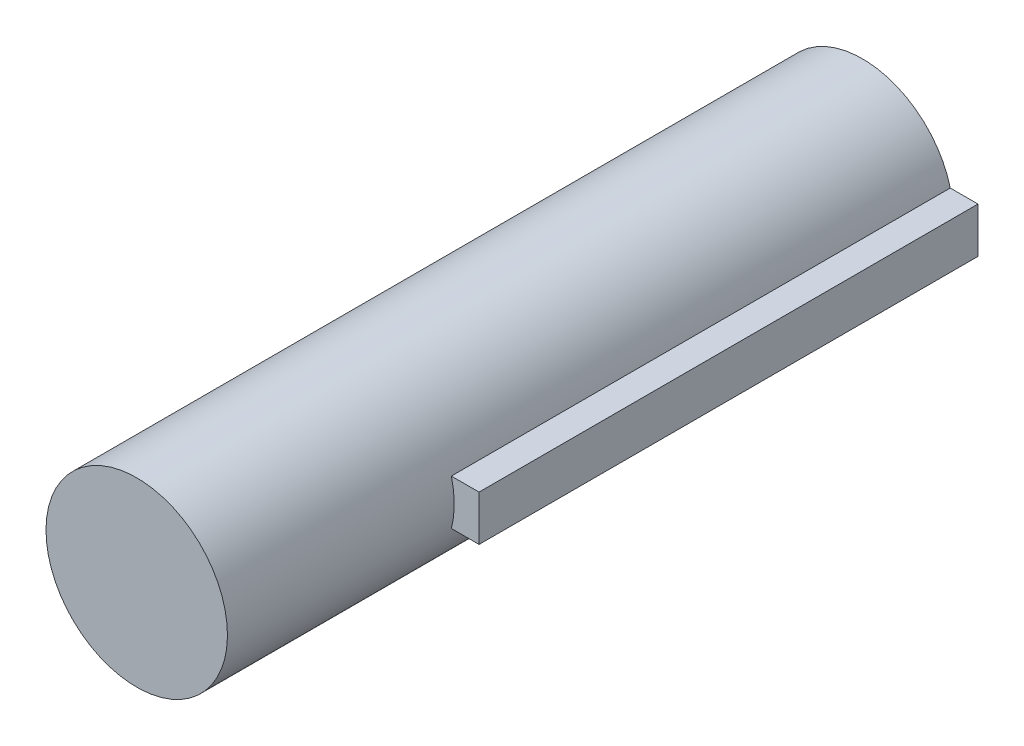
ISO-10303-21;
HEADER;
FILE_DESCRIPTION(('STEP AP214'),'2;1');
FILE_NAME('part.step','',(''),(''),'','','');
FILE_SCHEMA(('AUTOMOTIVE_DESIGN { 1 0 10303 214 1 1 1 1 }'));
ENDSEC;
DATA;
#1=APPLICATION_CONTEXT('core data for automotive mechanical design processes');
#2=APPLICATION_PROTOCOL_DEFINITION('international standard','automotive_design',2000,#1);
#3=PRODUCT_CONTEXT('',#1,'mechanical');
#4=PRODUCT('Part','Part','',(#3));
#5=PRODUCT_RELATED_PRODUCT_CATEGORY('part','',(#4));
#6=PRODUCT_DEFINITION_FORMATION('','',#4);
#7=PRODUCT_DEFINITION_CONTEXT('part definition',#1,'design');
#8=PRODUCT_DEFINITION('design','',#6,#7);
#9=PRODUCT_DEFINITION_SHAPE('','',#8);
#10=(LENGTH_UNIT() NAMED_UNIT(*) SI_UNIT(.MILLI.,.METRE.));
#11=(NAMED_UNIT(*) PLANE_ANGLE_UNIT() SI_UNIT($,.RADIAN.));
#12=(NAMED_UNIT(*) SI_UNIT($,.STERADIAN.) SOLID_ANGLE_UNIT());
#13=UNCERTAINTY_MEASURE_WITH_UNIT(LENGTH_MEASURE(1.E-05),#10,'distance_accuracy_value','');
#14=(GEOMETRIC_REPRESENTATION_CONTEXT(3) GLOBAL_UNCERTAINTY_ASSIGNED_CONTEXT((#13)) GLOBAL_UNIT_ASSIGNED_CONTEXT((#10,
#11,#12)) REPRESENTATION_CONTEXT('',''));
#15=CARTESIAN_POINT('',(0.,0.,0.));
#16=DIRECTION('',(0.,0.,1.));
#17=DIRECTION('',(1.,0.,0.));
#18=AXIS2_PLACEMENT_3D('',#15,#16,#17);
#19=CARTESIAN_POINT('',(0.,0.,160.));
#20=DIRECTION('',(0.,0.,-1.));
#21=DIRECTION('',(-1.,0.,0.));
#22=AXIS2_PLACEMENT_3D('',#19,#20,#21);
#23=CYLINDRICAL_SURFACE('',#22,20.);
#24=CARTESIAN_POINT('',(0.,0.,160.));
#25=DIRECTION('',(0.,0.,1.));
#26=DIRECTION('',(1.,0.,0.));
#27=AXIS2_PLACEMENT_3D('',#24,#25,#26);
#28=CIRCLE('',#27,20.);
#29=CARTESIAN_POINT('',(20.,0.,160.));
#30=VERTEX_POINT('',#29);
#31=EDGE_CURVE('E11',#30,#30,#28,.T.);
#32=ORIENTED_EDGE('',*,*,#31,.F.);
#33=EDGE_LOOP('',(#32));
#34=FACE_BOUND('',#33,.T.);
#35=DIRECTION('',(0.,0.,-1.));
#36=VECTOR('',#35,1.);
#37=CARTESIAN_POINT('',(19.3649167310371,5.,110.));
#38=LINE('',#37,#36);
#39=CARTESIAN_POINT('',(19.3649167310371,5.,110.));
#40=VERTEX_POINT('',#39);
#41=CARTESIAN_POINT('',(19.3649167310371,5.,0.));
#42=VERTEX_POINT('',#41);
#43=EDGE_CURVE('E109',#40,#42,#38,.T.);
#44=ORIENTED_EDGE('',*,*,#43,.T.);
#45=CARTESIAN_POINT('',(0.,0.,0.));
#46=DIRECTION('',(0.,0.,1.));
#47=DIRECTION('',(1.,0.,0.));
#48=AXIS2_PLACEMENT_3D('',#45,#46,#47);
#49=CIRCLE('',#48,20.);
#50=CARTESIAN_POINT('',(19.3649167310371,-5.,0.));
#51=VERTEX_POINT('',#50);
#52=EDGE_CURVE('E42',#42,#51,#49,.T.);
#53=ORIENTED_EDGE('',*,*,#52,.T.);
#54=DIRECTION('',(0.,0.,-1.));
#55=VECTOR('',#54,1.);
#56=CARTESIAN_POINT('',(19.3649167310371,-5.,110.));
#57=LINE('',#56,#55);
#58=CARTESIAN_POINT('',(19.3649167310371,-5.,110.));
#59=VERTEX_POINT('',#58);
#60=EDGE_CURVE('E53',#59,#51,#57,.T.);
#61=ORIENTED_EDGE('',*,*,#60,.F.);
#62=CARTESIAN_POINT('',(0.,0.,110.));
#63=DIRECTION('',(0.,0.,-1.));
#64=DIRECTION('',(-1.,0.,0.));
#65=AXIS2_PLACEMENT_3D('',#62,#63,#64);
#66=CIRCLE('',#65,20.);
#67=EDGE_CURVE('E57',#40,#59,#66,.T.);
#68=ORIENTED_EDGE('',*,*,#67,.F.);
#69=EDGE_LOOP('',(#44,#53,#61,#68));
#70=FACE_BOUND('',#69,.T.);
#71=ADVANCED_FACE('F39',(#34,#70),#23,.T.);
#72=CARTESIAN_POINT('',(0.,0.,160.));
#73=DIRECTION('',(0.,0.,1.));
#74=DIRECTION('',(1.,0.,0.));
#75=AXIS2_PLACEMENT_3D('',#72,#73,#74);
#76=PLANE('',#75);
#77=ORIENTED_EDGE('',*,*,#31,.T.);
#78=EDGE_LOOP('',(#77));
#79=FACE_BOUND('',#78,.T.);
#80=ADVANCED_FACE('F118',(#79),#76,.T.);
#81=CARTESIAN_POINT('',(0.,0.,0.));
#82=DIRECTION('',(0.,0.,1.));
#83=DIRECTION('',(1.,0.,0.));
#84=AXIS2_PLACEMENT_3D('',#81,#82,#83);
#85=PLANE('',#84);
#86=ORIENTED_EDGE('',*,*,#52,.F.);
#87=DIRECTION('',(-1.,0.,0.));
#88=VECTOR('',#87,1.);
#89=CARTESIAN_POINT('',(0.,5.,0.));
#90=LINE('',#89,#88);
#91=CARTESIAN_POINT('',(25.4782181019473,5.,0.));
#92=VERTEX_POINT('',#91);
#93=EDGE_CURVE('E98',#92,#42,#90,.T.);
#94=ORIENTED_EDGE('',*,*,#93,.F.);
#95=DIRECTION('',(0.,-1.,0.));
#96=VECTOR('',#95,1.);
#97=CARTESIAN_POINT('',(25.4782181019473,0.,0.));
#98=LINE('',#97,#96);
#99=CARTESIAN_POINT('',(25.4782181019473,-5.,0.));
#100=VERTEX_POINT('',#99);
#101=EDGE_CURVE('E105',#92,#100,#98,.T.);
#102=ORIENTED_EDGE('',*,*,#101,.T.);
#103=DIRECTION('',(-1.,0.,0.));
#104=VECTOR('',#103,1.);
#105=CARTESIAN_POINT('',(0.,-5.,0.));
#106=LINE('',#105,#104);
#107=EDGE_CURVE('E83',#100,#51,#106,.T.);
#108=ORIENTED_EDGE('',*,*,#107,.T.);
#109=EDGE_LOOP('',(#86,#94,#102,#108));
#110=FACE_BOUND('',#109,.T.);
#111=ADVANCED_FACE('F112',(#110),#85,.F.);
#112=CARTESIAN_POINT('',(25.4782181019473,0.,110.));
#113=DIRECTION('',(1.,0.,0.));
#114=DIRECTION('',(0.,0.,-1.));
#115=AXIS2_PLACEMENT_3D('',#112,#113,#114);
#116=PLANE('',#115);
#117=ORIENTED_EDGE('',*,*,#101,.F.);
#118=DIRECTION('',(0.,0.,-1.));
#119=VECTOR('',#118,1.);
#120=CARTESIAN_POINT('',(25.4782181019473,5.,110.));
#121=LINE('',#120,#119);
#122=CARTESIAN_POINT('',(25.4782181019473,5.,110.));
#123=VERTEX_POINT('',#122);
#124=EDGE_CURVE('E96',#123,#92,#121,.T.);
#125=ORIENTED_EDGE('',*,*,#124,.F.);
#126=DIRECTION('',(0.,-1.,0.));
#127=VECTOR('',#126,1.);
#128=CARTESIAN_POINT('',(25.4782181019473,0.,110.));
#129=LINE('',#128,#127);
#130=CARTESIAN_POINT('',(25.4782181019473,-5.,110.));
#131=VERTEX_POINT('',#130);
#132=EDGE_CURVE('E93',#123,#131,#129,.T.);
#133=ORIENTED_EDGE('',*,*,#132,.T.);
#134=DIRECTION('',(0.,0.,-1.));
#135=VECTOR('',#134,1.);
#136=CARTESIAN_POINT('',(25.4782181019473,-5.,110.));
#137=LINE('',#136,#135);
#138=EDGE_CURVE('E78',#131,#100,#137,.T.);
#139=ORIENTED_EDGE('',*,*,#138,.T.);
#140=EDGE_LOOP('',(#117,#125,#133,#139));
#141=FACE_BOUND('',#140,.T.);
#142=ADVANCED_FACE('F95',(#141),#116,.T.);
#143=CARTESIAN_POINT('',(0.,5.,110.));
#144=DIRECTION('',(0.,-1.,0.));
#145=DIRECTION('',(0.,0.,-1.));
#146=AXIS2_PLACEMENT_3D('',#143,#144,#145);
#147=PLANE('',#146);
#148=ORIENTED_EDGE('',*,*,#93,.T.);
#149=ORIENTED_EDGE('',*,*,#43,.F.);
#150=DIRECTION('',(-1.,0.,0.));
#151=VECTOR('',#150,1.);
#152=CARTESIAN_POINT('',(0.,5.,110.));
#153=LINE('',#152,#151);
#154=EDGE_CURVE('E88',#123,#40,#153,.T.);
#155=ORIENTED_EDGE('',*,*,#154,.F.);
#156=ORIENTED_EDGE('',*,*,#124,.T.);
#157=EDGE_LOOP('',(#148,#149,#155,#156));
#158=FACE_BOUND('',#157,.T.);
#159=ADVANCED_FACE('F116',(#158),#147,.F.);
#160=CARTESIAN_POINT('',(0.,-5.,110.));
#161=DIRECTION('',(0.,-1.,0.));
#162=DIRECTION('',(1.,0.,0.));
#163=AXIS2_PLACEMENT_3D('',#160,#161,#162);
#164=PLANE('',#163);
#165=ORIENTED_EDGE('',*,*,#107,.F.);
#166=ORIENTED_EDGE('',*,*,#138,.F.);
#167=DIRECTION('',(-1.,0.,0.));
#168=VECTOR('',#167,1.);
#169=CARTESIAN_POINT('',(0.,-5.,110.));
#170=LINE('',#169,#168);
#171=EDGE_CURVE('E81',#131,#59,#170,.T.);
#172=ORIENTED_EDGE('',*,*,#171,.T.);
#173=ORIENTED_EDGE('',*,*,#60,.T.);
#174=EDGE_LOOP('',(#165,#166,#172,#173));
#175=FACE_BOUND('',#174,.T.);
#176=ADVANCED_FACE('F80',(#175),#164,.T.);
#177=CARTESIAN_POINT('',(0.,0.,110.));
#178=DIRECTION('',(0.,0.,-1.));
#179=DIRECTION('',(-1.,0.,0.));
#180=AXIS2_PLACEMENT_3D('',#177,#178,#179);
#181=PLANE('',#180);
#182=ORIENTED_EDGE('',*,*,#132,.F.);
#183=ORIENTED_EDGE('',*,*,#154,.T.);
#184=ORIENTED_EDGE('',*,*,#67,.T.);
#185=ORIENTED_EDGE('',*,*,#171,.F.);
#186=EDGE_LOOP('',(#182,#183,#184,#185));
#187=FACE_BOUND('',#186,.T.);
#188=ADVANCED_FACE('F92',(#187),#181,.F.);
#189=CLOSED_SHELL('',(#71,#80,#111,#142,#159,#176,#188));
#190=MANIFOLD_SOLID_BREP('B2',#189);
#191=ADVANCED_BREP_SHAPE_REPRESENTATION('',(#18,#190),#14);
#192=SHAPE_DEFINITION_REPRESENTATION(#9,#191);
ENDSEC;
END-ISO-10303-21;
